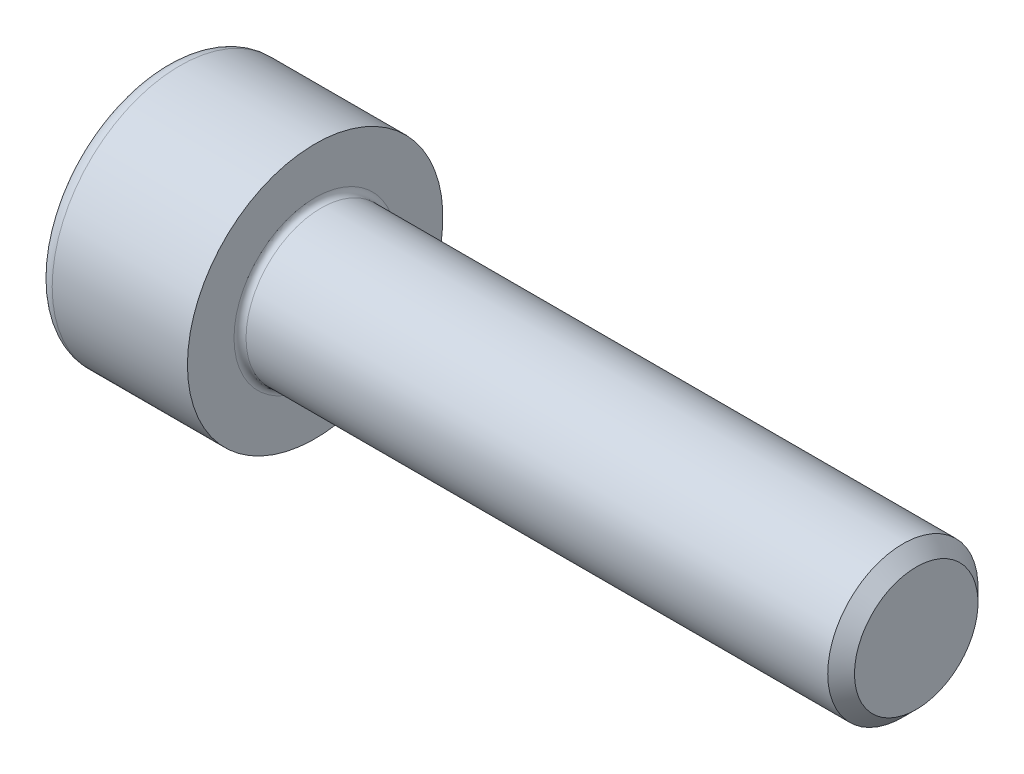
ISO-10303-21;
HEADER;
FILE_DESCRIPTION(('STEP AP214'),'2;1');
FILE_NAME('part.step','',(''),(''),'','','');
FILE_SCHEMA(('AUTOMOTIVE_DESIGN { 1 0 10303 214 1 1 1 1 }'));
ENDSEC;
DATA;
#1=APPLICATION_CONTEXT('core data for automotive mechanical design processes');
#2=APPLICATION_PROTOCOL_DEFINITION('international standard','automotive_design',2000,#1);
#3=PRODUCT_CONTEXT('',#1,'mechanical');
#4=PRODUCT('Part','Part','',(#3));
#5=PRODUCT_RELATED_PRODUCT_CATEGORY('part','',(#4));
#6=PRODUCT_DEFINITION_FORMATION('','',#4);
#7=PRODUCT_DEFINITION_CONTEXT('part definition',#1,'design');
#8=PRODUCT_DEFINITION('design','',#6,#7);
#9=PRODUCT_DEFINITION_SHAPE('','',#8);
#10=(LENGTH_UNIT() NAMED_UNIT(*) SI_UNIT(.MILLI.,.METRE.));
#11=(NAMED_UNIT(*) PLANE_ANGLE_UNIT() SI_UNIT($,.RADIAN.));
#12=(NAMED_UNIT(*) SI_UNIT($,.STERADIAN.) SOLID_ANGLE_UNIT());
#13=UNCERTAINTY_MEASURE_WITH_UNIT(LENGTH_MEASURE(1.E-05),#10,'distance_accuracy_value','');
#14=(GEOMETRIC_REPRESENTATION_CONTEXT(3) GLOBAL_UNCERTAINTY_ASSIGNED_CONTEXT((#13)) GLOBAL_UNIT_ASSIGNED_CONTEXT((#10,
#11,#12)) REPRESENTATION_CONTEXT('',''));
#15=CARTESIAN_POINT('',(0.,0.,0.));
#16=DIRECTION('',(0.,0.,1.));
#17=DIRECTION('',(1.,0.,0.));
#18=AXIS2_PLACEMENT_3D('',#15,#16,#17);
#19=CARTESIAN_POINT('',(2.5,2.32094808214229,0.));
#20=DIRECTION('',(1.,0.,0.));
#21=DIRECTION('',(0.,0.,-1.));
#22=AXIS2_PLACEMENT_3D('',#19,#20,#21);
#23=PLANE('',#22);
#24=DIRECTION('',(0.,1.,0.));
#25=VECTOR('',#24,1.);
#26=CARTESIAN_POINT('',(2.5,2.32094808214229,2.01));
#27=LINE('',#26,#25);
#28=CARTESIAN_POINT('',(2.50000000002785,0.,2.00999999995344));
#29=VERTEX_POINT('',#28);
#30=CARTESIAN_POINT('',(2.5,-1.16047404107115,2.01));
#31=VERTEX_POINT('',#30);
#32=EDGE_CURVE('E101',#29,#31,#27,.F.);
#33=ORIENTED_EDGE('',*,*,#32,.F.);
#34=CARTESIAN_POINT('',(2.50000000001296,0.,0.));
#35=DIRECTION('',(-1.,0.,0.));
#36=DIRECTION('',(0.,0.,1.));
#37=AXIS2_PLACEMENT_3D('',#34,#35,#36);
#38=CIRCLE('',#37,2.0099999999843);
#39=CARTESIAN_POINT('',(2.50000000000648,-1.74071106159993,1.00499999999608));
#40=VERTEX_POINT('',#39);
#41=EDGE_CURVE('E103',#29,#40,#38,.F.);
#42=ORIENTED_EDGE('',*,*,#41,.T.);
#43=DIRECTION('',(0.,-0.500000000000001,-0.866025403784438));
#44=VECTOR('',#43,1.);
#45=CARTESIAN_POINT('',(2.5,-1.16047404107115,2.01));
#46=LINE('',#45,#44);
#47=EDGE_CURVE('E106',#31,#40,#46,.T.);
#48=ORIENTED_EDGE('',*,*,#47,.F.);
#49=EDGE_LOOP('',(#33,#42,#48));
#50=FACE_BOUND('',#49,.T.);
#51=ADVANCED_FACE('F16',(#50),#23,.F.);
#52=CARTESIAN_POINT('',(2.5,2.32094808214229,0.));
#53=DIRECTION('',(1.,0.,0.));
#54=DIRECTION('',(0.,0.,-1.));
#55=AXIS2_PLACEMENT_3D('',#52,#53,#54);
#56=PLANE('',#55);
#57=DIRECTION('',(0.,-0.500000000000001,-0.866025403784438));
#58=VECTOR('',#57,1.);
#59=CARTESIAN_POINT('',(2.5,-1.74071106160673,1.00500000000001));
#60=LINE('',#59,#58);
#61=CARTESIAN_POINT('',(2.5,-2.3209480821423,0.));
#62=VERTEX_POINT('',#61);
#63=EDGE_CURVE('E175',#40,#62,#60,.T.);
#64=ORIENTED_EDGE('',*,*,#63,.F.);
#65=CARTESIAN_POINT('',(2.50000000001296,0.,0.));
#66=DIRECTION('',(-1.,0.,0.));
#67=DIRECTION('',(0.,0.,1.));
#68=AXIS2_PLACEMENT_3D('',#65,#66,#67);
#69=CIRCLE('',#68,2.0099999999843);
#70=CARTESIAN_POINT('',(2.50000000000648,-1.74071106159993,-1.00499999999608));
#71=VERTEX_POINT('',#70);
#72=EDGE_CURVE('E121',#40,#71,#69,.F.);
#73=ORIENTED_EDGE('',*,*,#72,.T.);
#74=DIRECTION('',(0.,0.5,-0.866025403784439));
#75=VECTOR('',#74,1.);
#76=CARTESIAN_POINT('',(2.5,-2.3209480821423,0.));
#77=LINE('',#76,#75);
#78=EDGE_CURVE('E171',#62,#71,#77,.T.);
#79=ORIENTED_EDGE('',*,*,#78,.F.);
#80=EDGE_LOOP('',(#64,#73,#79));
#81=FACE_BOUND('',#80,.T.);
#82=ADVANCED_FACE('F365',(#81),#56,.F.);
#83=CARTESIAN_POINT('',(2.5,2.32094808214229,0.));
#84=DIRECTION('',(1.,0.,0.));
#85=DIRECTION('',(0.,0.,-1.));
#86=AXIS2_PLACEMENT_3D('',#83,#84,#85);
#87=PLANE('',#86);
#88=DIRECTION('',(0.,0.5,-0.866025403784439));
#89=VECTOR('',#88,1.);
#90=CARTESIAN_POINT('',(2.5,-1.74071106160673,-1.005));
#91=LINE('',#90,#89);
#92=CARTESIAN_POINT('',(2.5,-1.16047404107116,-2.01));
#93=VERTEX_POINT('',#92);
#94=EDGE_CURVE('E167',#71,#93,#91,.T.);
#95=ORIENTED_EDGE('',*,*,#94,.F.);
#96=CARTESIAN_POINT('',(2.50000000001296,0.,0.));
#97=DIRECTION('',(-1.,0.,0.));
#98=DIRECTION('',(0.,0.,1.));
#99=AXIS2_PLACEMENT_3D('',#96,#97,#98);
#100=CIRCLE('',#99,2.0099999999843);
#101=CARTESIAN_POINT('',(2.50000000002785,5.81513196131503E-13,-2.00999999995344));
#102=VERTEX_POINT('',#101);
#103=EDGE_CURVE('E221',#71,#102,#100,.F.);
#104=ORIENTED_EDGE('',*,*,#103,.T.);
#105=DIRECTION('',(0.,1.,0.));
#106=VECTOR('',#105,1.);
#107=CARTESIAN_POINT('',(2.5,2.32094808214229,-2.01));
#108=LINE('',#107,#106);
#109=EDGE_CURVE('E163',#93,#102,#108,.T.);
#110=ORIENTED_EDGE('',*,*,#109,.F.);
#111=EDGE_LOOP('',(#95,#104,#110));
#112=FACE_BOUND('',#111,.T.);
#113=ADVANCED_FACE('F359',(#112),#87,.F.);
#114=CARTESIAN_POINT('',(2.5,2.32094808214229,0.));
#115=DIRECTION('',(1.,0.,0.));
#116=DIRECTION('',(0.,0.,-1.));
#117=AXIS2_PLACEMENT_3D('',#114,#115,#116);
#118=PLANE('',#117);
#119=DIRECTION('',(0.,1.,0.));
#120=VECTOR('',#119,1.);
#121=CARTESIAN_POINT('',(2.5,2.32094808214229,-2.01));
#122=LINE('',#121,#120);
#123=CARTESIAN_POINT('',(2.5,1.16047404107114,-2.01));
#124=VERTEX_POINT('',#123);
#125=EDGE_CURVE('E159',#102,#124,#122,.T.);
#126=ORIENTED_EDGE('',*,*,#125,.F.);
#127=CARTESIAN_POINT('',(2.50000000001296,0.,0.));
#128=DIRECTION('',(-1.,0.,0.));
#129=DIRECTION('',(0.,0.,1.));
#130=AXIS2_PLACEMENT_3D('',#127,#128,#129);
#131=CIRCLE('',#130,2.0099999999843);
#132=CARTESIAN_POINT('',(2.50000000000648,1.74071106159992,-1.00499999999608));
#133=VERTEX_POINT('',#132);
#134=EDGE_CURVE('E218',#102,#133,#131,.F.);
#135=ORIENTED_EDGE('',*,*,#134,.T.);
#136=DIRECTION('',(0.,0.500000000000001,0.866025403784438));
#137=VECTOR('',#136,1.);
#138=CARTESIAN_POINT('',(2.5,1.16047404107114,-2.01));
#139=LINE('',#138,#137);
#140=EDGE_CURVE('E155',#124,#133,#139,.T.);
#141=ORIENTED_EDGE('',*,*,#140,.F.);
#142=EDGE_LOOP('',(#126,#135,#141));
#143=FACE_BOUND('',#142,.T.);
#144=ADVANCED_FACE('F351',(#143),#118,.F.);
#145=CARTESIAN_POINT('',(2.5,2.32094808214229,0.));
#146=DIRECTION('',(1.,0.,0.));
#147=DIRECTION('',(0.,0.,-1.));
#148=AXIS2_PLACEMENT_3D('',#145,#146,#147);
#149=PLANE('',#148);
#150=DIRECTION('',(0.,0.500000000000002,0.866025403784438));
#151=VECTOR('',#150,1.);
#152=CARTESIAN_POINT('',(2.5,1.74071106160672,-1.005));
#153=LINE('',#152,#151);
#154=CARTESIAN_POINT('',(2.5,2.32094808214229,0.));
#155=VERTEX_POINT('',#154);
#156=EDGE_CURVE('E151',#133,#155,#153,.T.);
#157=ORIENTED_EDGE('',*,*,#156,.F.);
#158=CARTESIAN_POINT('',(2.50000000001296,0.,0.));
#159=DIRECTION('',(-1.,0.,0.));
#160=DIRECTION('',(0.,0.,1.));
#161=AXIS2_PLACEMENT_3D('',#158,#159,#160);
#162=CIRCLE('',#161,2.0099999999843);
#163=CARTESIAN_POINT('',(2.50000000000648,1.74071106159992,1.00499999999608));
#164=VERTEX_POINT('',#163);
#165=EDGE_CURVE('E129',#133,#164,#162,.F.);
#166=ORIENTED_EDGE('',*,*,#165,.T.);
#167=DIRECTION('',(0.,-0.5,0.866025403784439));
#168=VECTOR('',#167,1.);
#169=CARTESIAN_POINT('',(2.5,2.32094808214229,0.));
#170=LINE('',#169,#168);
#171=EDGE_CURVE('E122',#155,#164,#170,.T.);
#172=ORIENTED_EDGE('',*,*,#171,.F.);
#173=EDGE_LOOP('',(#157,#166,#172));
#174=FACE_BOUND('',#173,.T.);
#175=ADVANCED_FACE('F347',(#174),#149,.F.);
#176=CARTESIAN_POINT('',(2.50000000011141,0.,0.));
#177=DIRECTION('',(-1.,0.,0.));
#178=DIRECTION('',(0.,0.,1.));
#179=AXIS2_PLACEMENT_3D('',#176,#177,#178);
#180=CONICAL_SURFACE('',#179,2.00999999981377,1.04719755104565);
#181=CARTESIAN_POINT('',(3.66047404099845,0.,1.13686837721616E-10));
#182=VERTEX_POINT('',#181);
#183=VERTEX_LOOP('',#182);
#184=FACE_BOUND('',#183,.T.);
#185=ORIENTED_EDGE('',*,*,#41,.F.);
#186=CARTESIAN_POINT('',(2.50000000001296,0.,0.));
#187=DIRECTION('',(-1.,0.,0.));
#188=DIRECTION('',(0.,0.,1.));
#189=AXIS2_PLACEMENT_3D('',#186,#187,#188);
#190=CIRCLE('',#189,2.0099999999843);
#191=EDGE_CURVE('E117',#29,#164,#190,.T.);
#192=ORIENTED_EDGE('',*,*,#191,.T.);
#193=ORIENTED_EDGE('',*,*,#165,.F.);
#194=ORIENTED_EDGE('',*,*,#134,.F.);
#195=ORIENTED_EDGE('',*,*,#103,.F.);
#196=ORIENTED_EDGE('',*,*,#72,.F.);
#197=EDGE_LOOP('',(#185,#192,#193,#194,#195,#196));
#198=FACE_BOUND('',#197,.T.);
#199=ADVANCED_FACE('F115',(#184,#198),#180,.F.);
#200=CARTESIAN_POINT('',(2.5,2.32094808214229,0.));
#201=DIRECTION('',(1.,0.,0.));
#202=DIRECTION('',(0.,0.,-1.));
#203=AXIS2_PLACEMENT_3D('',#200,#201,#202);
#204=PLANE('',#203);
#205=DIRECTION('',(0.,0.5,-0.866025403784439));
#206=VECTOR('',#205,1.);
#207=CARTESIAN_POINT('',(2.5,2.32094808214229,0.));
#208=LINE('',#207,#206);
#209=CARTESIAN_POINT('',(2.5,1.16047404107114,2.01));
#210=VERTEX_POINT('',#209);
#211=EDGE_CURVE('E128',#164,#210,#208,.F.);
#212=ORIENTED_EDGE('',*,*,#211,.F.);
#213=ORIENTED_EDGE('',*,*,#191,.F.);
#214=DIRECTION('',(0.,-1.,0.));
#215=VECTOR('',#214,1.);
#216=CARTESIAN_POINT('',(2.5,-1.16047404107115,2.01));
#217=LINE('',#216,#215);
#218=EDGE_CURVE('E126',#29,#210,#217,.F.);
#219=ORIENTED_EDGE('',*,*,#218,.T.);
#220=EDGE_LOOP('',(#212,#213,#219));
#221=FACE_BOUND('',#220,.T.);
#222=ADVANCED_FACE('F125',(#221),#204,.F.);
#223=CARTESIAN_POINT('',(2.5,2.32094808214229,0.));
#224=DIRECTION('',(0.,-0.866025403784439,-0.5));
#225=DIRECTION('',(0.,0.5,-0.866025403784439));
#226=AXIS2_PLACEMENT_3D('',#223,#224,#225);
#227=PLANE('',#226);
#228=ORIENTED_EDGE('',*,*,#211,.T.);
#229=DIRECTION('',(1.,0.,0.));
#230=VECTOR('',#229,1.);
#231=CARTESIAN_POINT('',(2.5,1.16047404107114,2.01));
#232=LINE('',#231,#230);
#233=CARTESIAN_POINT('',(0.,1.16047404107114,2.01));
#234=VERTEX_POINT('',#233);
#235=EDGE_CURVE('E134',#210,#234,#232,.F.);
#236=ORIENTED_EDGE('',*,*,#235,.T.);
#237=DIRECTION('',(0.,-0.5,0.866025403784439));
#238=VECTOR('',#237,1.);
#239=CARTESIAN_POINT('',(0.,2.32094808214229,0.));
#240=LINE('',#239,#238);
#241=CARTESIAN_POINT('',(0.,2.32094808214229,0.));
#242=VERTEX_POINT('',#241);
#243=EDGE_CURVE('E194',#242,#234,#240,.T.);
#244=ORIENTED_EDGE('',*,*,#243,.F.);
#245=DIRECTION('',(1.,0.,0.));
#246=VECTOR('',#245,1.);
#247=CARTESIAN_POINT('',(2.5,2.32094808214229,0.));
#248=LINE('',#247,#246);
#249=EDGE_CURVE('E186',#242,#155,#248,.T.);
#250=ORIENTED_EDGE('',*,*,#249,.T.);
#251=ORIENTED_EDGE('',*,*,#171,.T.);
#252=EDGE_LOOP('',(#228,#236,#244,#250,#251));
#253=FACE_BOUND('',#252,.T.);
#254=ADVANCED_FACE('F340',(#253),#227,.T.);
#255=CARTESIAN_POINT('',(2.5,-1.16047404107115,2.01));
#256=DIRECTION('',(0.,0.,1.));
#257=DIRECTION('',(0.,-1.,0.));
#258=AXIS2_PLACEMENT_3D('',#255,#256,#257);
#259=PLANE('',#258);
#260=ORIENTED_EDGE('',*,*,#235,.F.);
#261=ORIENTED_EDGE('',*,*,#218,.F.);
#262=ORIENTED_EDGE('',*,*,#32,.T.);
#263=DIRECTION('',(1.,0.,0.));
#264=VECTOR('',#263,1.);
#265=CARTESIAN_POINT('',(2.5,-1.16047404107115,2.01));
#266=LINE('',#265,#264);
#267=CARTESIAN_POINT('',(0.,-1.16047404107115,2.01));
#268=VERTEX_POINT('',#267);
#269=EDGE_CURVE('E136',#268,#31,#266,.T.);
#270=ORIENTED_EDGE('',*,*,#269,.F.);
#271=DIRECTION('',(0.,1.,0.));
#272=VECTOR('',#271,1.);
#273=CARTESIAN_POINT('',(0.,0.,2.01));
#274=LINE('',#273,#272);
#275=EDGE_CURVE('E335',#234,#268,#274,.F.);
#276=ORIENTED_EDGE('',*,*,#275,.F.);
#277=EDGE_LOOP('',(#260,#261,#262,#270,#276));
#278=FACE_BOUND('',#277,.T.);
#279=ADVANCED_FACE('F132',(#278),#259,.F.);
#280=CARTESIAN_POINT('',(2.5,-1.16047404107115,2.01));
#281=DIRECTION('',(0.,0.866025403784438,-0.500000000000001));
#282=DIRECTION('',(0.,0.500000000000001,0.866025403784438));
#283=AXIS2_PLACEMENT_3D('',#280,#281,#282);
#284=PLANE('',#283);
#285=ORIENTED_EDGE('',*,*,#63,.T.);
#286=DIRECTION('',(1.,0.,0.));
#287=VECTOR('',#286,1.);
#288=CARTESIAN_POINT('',(2.5,-2.3209480821423,0.));
#289=LINE('',#288,#287);
#290=CARTESIAN_POINT('',(0.,-2.3209480821423,0.));
#291=VERTEX_POINT('',#290);
#292=EDGE_CURVE('E198',#291,#62,#289,.T.);
#293=ORIENTED_EDGE('',*,*,#292,.F.);
#294=DIRECTION('',(0.,-0.500000000000001,-0.866025403784438));
#295=VECTOR('',#294,1.);
#296=CARTESIAN_POINT('',(0.,-1.16047404107115,2.01));
#297=LINE('',#296,#295);
#298=EDGE_CURVE('E332',#268,#291,#297,.T.);
#299=ORIENTED_EDGE('',*,*,#298,.F.);
#300=ORIENTED_EDGE('',*,*,#269,.T.);
#301=ORIENTED_EDGE('',*,*,#47,.T.);
#302=EDGE_LOOP('',(#285,#293,#299,#300,#301));
#303=FACE_BOUND('',#302,.T.);
#304=ADVANCED_FACE('F367',(#303),#284,.T.);
#305=CARTESIAN_POINT('',(2.5,-2.3209480821423,0.));
#306=DIRECTION('',(0.,0.866025403784439,0.5));
#307=DIRECTION('',(0.,-0.5,0.866025403784439));
#308=AXIS2_PLACEMENT_3D('',#305,#306,#307);
#309=PLANE('',#308);
#310=ORIENTED_EDGE('',*,*,#94,.T.);
#311=DIRECTION('',(1.,0.,0.));
#312=VECTOR('',#311,1.);
#313=CARTESIAN_POINT('',(2.5,-1.16047404107116,-2.01));
#314=LINE('',#313,#312);
#315=CARTESIAN_POINT('',(0.,-1.16047404107116,-2.01));
#316=VERTEX_POINT('',#315);
#317=EDGE_CURVE('E190',#93,#316,#314,.F.);
#318=ORIENTED_EDGE('',*,*,#317,.T.);
#319=DIRECTION('',(0.,0.5,-0.866025403784438));
#320=VECTOR('',#319,1.);
#321=CARTESIAN_POINT('',(0.,-2.3209480821423,0.));
#322=LINE('',#321,#320);
#323=EDGE_CURVE('E327',#291,#316,#322,.T.);
#324=ORIENTED_EDGE('',*,*,#323,.F.);
#325=ORIENTED_EDGE('',*,*,#292,.T.);
#326=ORIENTED_EDGE('',*,*,#78,.T.);
#327=EDGE_LOOP('',(#310,#318,#324,#325,#326));
#328=FACE_BOUND('',#327,.T.);
#329=ADVANCED_FACE('F361',(#328),#309,.T.);
#330=CARTESIAN_POINT('',(2.5,1.16047404107114,-2.01));
#331=DIRECTION('',(0.,0.,-1.));
#332=DIRECTION('',(0.,1.,0.));
#333=AXIS2_PLACEMENT_3D('',#330,#331,#332);
#334=PLANE('',#333);
#335=ORIENTED_EDGE('',*,*,#317,.F.);
#336=ORIENTED_EDGE('',*,*,#109,.T.);
#337=ORIENTED_EDGE('',*,*,#125,.T.);
#338=DIRECTION('',(1.,0.,0.));
#339=VECTOR('',#338,1.);
#340=CARTESIAN_POINT('',(2.5,1.16047404107114,-2.01));
#341=LINE('',#340,#339);
#342=CARTESIAN_POINT('',(0.,1.16047404107114,-2.01));
#343=VERTEX_POINT('',#342);
#344=EDGE_CURVE('E189',#124,#343,#341,.F.);
#345=ORIENTED_EDGE('',*,*,#344,.T.);
#346=DIRECTION('',(0.,1.,0.));
#347=VECTOR('',#346,1.);
#348=CARTESIAN_POINT('',(0.,0.,-2.01));
#349=LINE('',#348,#347);
#350=EDGE_CURVE('E323',#316,#343,#349,.T.);
#351=ORIENTED_EDGE('',*,*,#350,.F.);
#352=EDGE_LOOP('',(#335,#336,#337,#345,#351));
#353=FACE_BOUND('',#352,.T.);
#354=ADVANCED_FACE('F354',(#353),#334,.F.);
#355=CARTESIAN_POINT('',(2.5,2.32094808214229,0.));
#356=DIRECTION('',(0.,0.866025403784438,-0.500000000000001));
#357=DIRECTION('',(0.,0.500000000000001,0.866025403784438));
#358=AXIS2_PLACEMENT_3D('',#355,#356,#357);
#359=PLANE('',#358);
#360=ORIENTED_EDGE('',*,*,#344,.F.);
#361=ORIENTED_EDGE('',*,*,#140,.T.);
#362=ORIENTED_EDGE('',*,*,#156,.T.);
#363=ORIENTED_EDGE('',*,*,#249,.F.);
#364=DIRECTION('',(0.,0.500000000000001,0.866025403784438));
#365=VECTOR('',#364,1.);
#366=CARTESIAN_POINT('',(0.,1.16047404107114,-2.01));
#367=LINE('',#366,#365);
#368=EDGE_CURVE('E321',#343,#242,#367,.T.);
#369=ORIENTED_EDGE('',*,*,#368,.F.);
#370=EDGE_LOOP('',(#360,#361,#362,#363,#369));
#371=FACE_BOUND('',#370,.T.);
#372=ADVANCED_FACE('F297',(#371),#359,.F.);
#373=CARTESIAN_POINT('',(0.,0.,0.));
#374=DIRECTION('',(-1.,0.,0.));
#375=DIRECTION('',(0.,0.,1.));
#376=AXIS2_PLACEMENT_3D('',#373,#374,#375);
#377=PLANE('',#376);
#378=CARTESIAN_POINT('',(0.,0.,0.));
#379=DIRECTION('',(1.,0.,0.));
#380=DIRECTION('',(0.,0.,-1.));
#381=AXIS2_PLACEMENT_3D('',#378,#379,#380);
#382=CIRCLE('',#381,3.75);
#383=CARTESIAN_POINT('',(0.,0.,-3.75));
#384=VERTEX_POINT('',#383);
#385=CARTESIAN_POINT('',(0.,0.,3.75));
#386=VERTEX_POINT('',#385);
#387=EDGE_CURVE('E318',#384,#386,#382,.T.);
#388=ORIENTED_EDGE('',*,*,#387,.F.);
#389=CARTESIAN_POINT('',(0.,0.,0.));
#390=DIRECTION('',(1.,0.,0.));
#391=DIRECTION('',(0.,0.,1.));
#392=AXIS2_PLACEMENT_3D('',#389,#390,#391);
#393=CIRCLE('',#392,3.75);
#394=EDGE_CURVE('E316',#386,#384,#393,.T.);
#395=ORIENTED_EDGE('',*,*,#394,.F.);
#396=EDGE_LOOP('',(#388,#395));
#397=FACE_BOUND('',#396,.T.);
#398=ORIENTED_EDGE('',*,*,#350,.T.);
#399=ORIENTED_EDGE('',*,*,#368,.T.);
#400=ORIENTED_EDGE('',*,*,#243,.T.);
#401=ORIENTED_EDGE('',*,*,#275,.T.);
#402=ORIENTED_EDGE('',*,*,#298,.T.);
#403=ORIENTED_EDGE('',*,*,#323,.T.);
#404=EDGE_LOOP('',(#398,#399,#400,#401,#402,#403));
#405=FACE_BOUND('',#404,.T.);
#406=ADVANCED_FACE('F291',(#397,#405),#377,.T.);
#407=CARTESIAN_POINT('',(0.5,0.,0.));
#408=DIRECTION('',(-1.,0.,0.));
#409=DIRECTION('',(0.,0.,1.));
#410=AXIS2_PLACEMENT_3D('',#407,#408,#409);
#411=TOROIDAL_SURFACE('',#410,3.75,0.5);
#412=CARTESIAN_POINT('',(0.5,0.,0.));
#413=DIRECTION('',(-1.,0.,0.));
#414=DIRECTION('',(0.,0.,1.));
#415=AXIS2_PLACEMENT_3D('',#412,#413,#414);
#416=CIRCLE('',#415,4.25);
#417=CARTESIAN_POINT('',(0.5,0.,4.25));
#418=VERTEX_POINT('',#417);
#419=EDGE_CURVE('E214',#418,#418,#416,.F.);
#420=ORIENTED_EDGE('',*,*,#419,.F.);
#421=EDGE_LOOP('',(#420));
#422=FACE_BOUND('',#421,.T.);
#423=ORIENTED_EDGE('',*,*,#394,.T.);
#424=ORIENTED_EDGE('',*,*,#387,.T.);
#425=EDGE_LOOP('',(#423,#424));
#426=FACE_BOUND('',#425,.T.);
#427=ADVANCED_FACE('F286',(#422,#426),#411,.T.);
#428=CARTESIAN_POINT('',(-31.75,0.,0.));
#429=DIRECTION('',(-1.,0.,0.));
#430=DIRECTION('',(0.,0.,1.));
#431=AXIS2_PLACEMENT_3D('',#428,#429,#430);
#432=CYLINDRICAL_SURFACE('',#431,4.25);
#433=CARTESIAN_POINT('',(5.,0.,0.));
#434=DIRECTION('',(-1.,0.,0.));
#435=DIRECTION('',(0.,0.,1.));
#436=AXIS2_PLACEMENT_3D('',#433,#434,#435);
#437=CIRCLE('',#436,4.25);
#438=CARTESIAN_POINT('',(5.,0.,4.25));
#439=VERTEX_POINT('',#438);
#440=EDGE_CURVE('E212',#439,#439,#437,.F.);
#441=ORIENTED_EDGE('',*,*,#440,.F.);
#442=EDGE_LOOP('',(#441));
#443=FACE_BOUND('',#442,.T.);
#444=ORIENTED_EDGE('',*,*,#419,.T.);
#445=EDGE_LOOP('',(#444));
#446=FACE_BOUND('',#445,.T.);
#447=ADVANCED_FACE('F290',(#443,#446),#432,.T.);
#448=CARTESIAN_POINT('',(25.,2.055,0.));
#449=DIRECTION('',(1.,0.,0.));
#450=DIRECTION('',(0.,0.,-1.));
#451=AXIS2_PLACEMENT_3D('',#448,#449,#450);
#452=PLANE('',#451);
#453=CARTESIAN_POINT('',(24.9999999999773,0.,0.));
#454=DIRECTION('',(-1.,0.,0.));
#455=DIRECTION('',(0.,0.,1.));
#456=AXIS2_PLACEMENT_3D('',#453,#454,#455);
#457=CIRCLE('',#456,2.05499999998437);
#458=CARTESIAN_POINT('',(24.9999999999773,0.,2.05499999998437));
#459=VERTEX_POINT('',#458);
#460=EDGE_CURVE('E208',#459,#459,#457,.T.);
#461=ORIENTED_EDGE('',*,*,#460,.F.);
#462=EDGE_LOOP('',(#461));
#463=FACE_BOUND('',#462,.T.);
#464=ADVANCED_FACE('F263',(#463),#452,.T.);
#465=CARTESIAN_POINT('',(5.,4.25,0.));
#466=DIRECTION('',(1.,0.,0.));
#467=DIRECTION('',(0.,0.,-1.));
#468=AXIS2_PLACEMENT_3D('',#465,#466,#467);
#469=PLANE('',#468);
#470=ORIENTED_EDGE('',*,*,#440,.T.);
#471=EDGE_LOOP('',(#470));
#472=FACE_BOUND('',#471,.T.);
#473=CARTESIAN_POINT('',(5.,0.,0.));
#474=DIRECTION('',(1.,0.,0.));
#475=DIRECTION('',(0.,0.,1.));
#476=AXIS2_PLACEMENT_3D('',#473,#474,#475);
#477=CIRCLE('',#476,2.7);
#478=CARTESIAN_POINT('',(5.,0.,-2.7));
#479=VERTEX_POINT('',#478);
#480=CARTESIAN_POINT('',(5.,0.,2.7));
#481=VERTEX_POINT('',#480);
#482=EDGE_CURVE('E211',#479,#481,#477,.F.);
#483=ORIENTED_EDGE('',*,*,#482,.T.);
#484=CARTESIAN_POINT('',(5.,0.,0.));
#485=DIRECTION('',(1.,0.,0.));
#486=DIRECTION('',(0.,0.,-1.));
#487=AXIS2_PLACEMENT_3D('',#484,#485,#486);
#488=CIRCLE('',#487,2.7);
#489=EDGE_CURVE('E35',#481,#479,#488,.F.);
#490=ORIENTED_EDGE('',*,*,#489,.T.);
#491=EDGE_LOOP('',(#483,#490));
#492=FACE_BOUND('',#491,.T.);
#493=ADVANCED_FACE('F254',(#472,#492),#469,.T.);
#494=CARTESIAN_POINT('',(24.5550000000208,0.,0.));
#495=DIRECTION('',(-1.,0.,0.));
#496=DIRECTION('',(0.,0.,1.));
#497=AXIS2_PLACEMENT_3D('',#494,#495,#496);
#498=CONICAL_SURFACE('',#497,2.49999999988404,0.785398163333579);
#499=CARTESIAN_POINT('',(24.555,0.,0.));
#500=DIRECTION('',(-1.,0.,0.));
#501=DIRECTION('',(0.,0.,1.));
#502=AXIS2_PLACEMENT_3D('',#499,#500,#501);
#503=CIRCLE('',#502,2.5);
#504=CARTESIAN_POINT('',(24.555,0.,2.5));
#505=VERTEX_POINT('',#504);
#506=EDGE_CURVE('E27',#505,#505,#503,.T.);
#507=ORIENTED_EDGE('',*,*,#506,.F.);
#508=EDGE_LOOP('',(#507));
#509=FACE_BOUND('',#508,.T.);
#510=ORIENTED_EDGE('',*,*,#460,.T.);
#511=EDGE_LOOP('',(#510));
#512=FACE_BOUND('',#511,.T.);
#513=ADVANCED_FACE('F242',(#509,#512),#498,.T.);
#514=CARTESIAN_POINT('',(5.2,0.,0.));
#515=DIRECTION('',(1.,0.,0.));
#516=DIRECTION('',(0.,0.,-1.));
#517=AXIS2_PLACEMENT_3D('',#514,#515,#516);
#518=TOROIDAL_SURFACE('',#517,2.7,0.2);
#519=CARTESIAN_POINT('',(5.2,0.,0.));
#520=DIRECTION('',(-1.,0.,0.));
#521=DIRECTION('',(0.,0.,1.));
#522=AXIS2_PLACEMENT_3D('',#519,#520,#521);
#523=CIRCLE('',#522,2.5);
#524=CARTESIAN_POINT('',(5.2,0.,2.5));
#525=VERTEX_POINT('',#524);
#526=EDGE_CURVE('E11',#525,#525,#523,.F.);
#527=ORIENTED_EDGE('',*,*,#526,.F.);
#528=EDGE_LOOP('',(#527));
#529=FACE_BOUND('',#528,.T.);
#530=ORIENTED_EDGE('',*,*,#482,.F.);
#531=ORIENTED_EDGE('',*,*,#489,.F.);
#532=EDGE_LOOP('',(#530,#531));
#533=FACE_BOUND('',#532,.T.);
#534=ADVANCED_FACE('F230',(#529,#533),#518,.F.);
#535=CARTESIAN_POINT('',(-31.75,0.,0.));
#536=DIRECTION('',(-1.,0.,0.));
#537=DIRECTION('',(0.,0.,1.));
#538=AXIS2_PLACEMENT_3D('',#535,#536,#537);
#539=CYLINDRICAL_SURFACE('',#538,2.5);
#540=ORIENTED_EDGE('',*,*,#526,.T.);
#541=EDGE_LOOP('',(#540));
#542=FACE_BOUND('',#541,.T.);
#543=ORIENTED_EDGE('',*,*,#506,.T.);
#544=EDGE_LOOP('',(#543));
#545=FACE_BOUND('',#544,.T.);
#546=ADVANCED_FACE('F241',(#542,#545),#539,.T.);
#547=CLOSED_SHELL('',(#51,#82,#113,#144,#175,#199,#222,#254,#279,#304,#329,#354,#372,#406,#427,
#447,#464,#493,#513,#534,#546));
#548=MANIFOLD_SOLID_BREP('B1',#547);
#549=ADVANCED_BREP_SHAPE_REPRESENTATION('',(#18,#548),#14);
#550=SHAPE_DEFINITION_REPRESENTATION(#9,#549);
ENDSEC;
END-ISO-10303-21;
